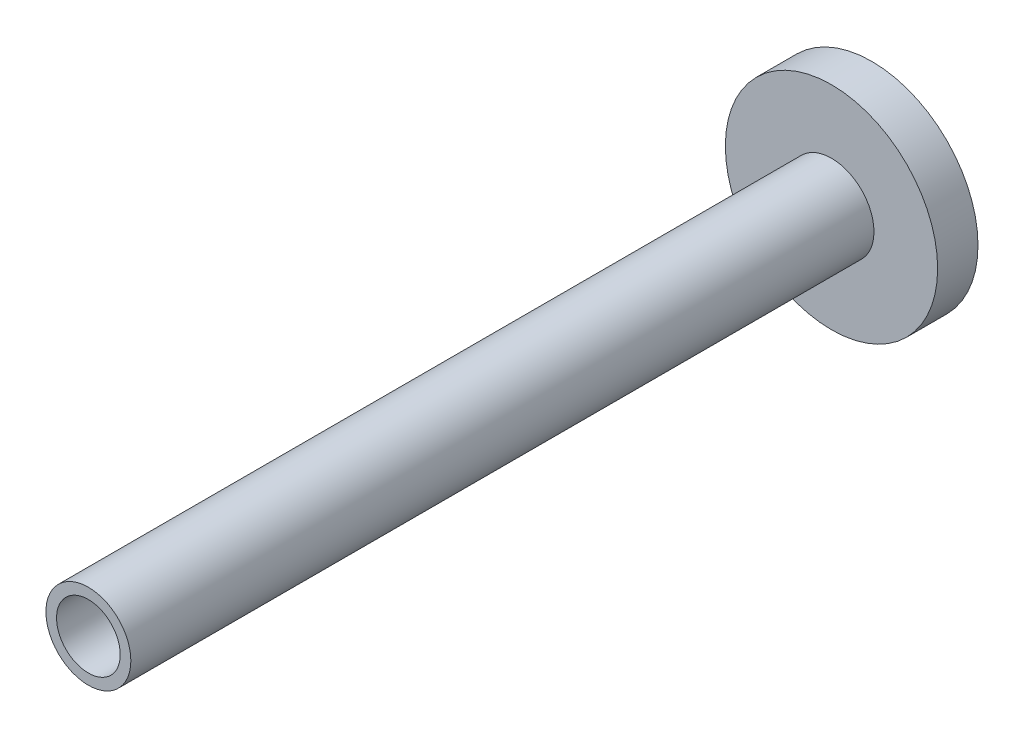
ISO-10303-21;
HEADER;
FILE_DESCRIPTION(('STEP AP214'),'2;1');
FILE_NAME('part.step','',(''),(''),'','','');
FILE_SCHEMA(('AUTOMOTIVE_DESIGN { 1 0 10303 214 1 1 1 1 }'));
ENDSEC;
DATA;
#1=APPLICATION_CONTEXT('core data for automotive mechanical design processes');
#2=APPLICATION_PROTOCOL_DEFINITION('international standard','automotive_design',2000,#1);
#3=PRODUCT_CONTEXT('',#1,'mechanical');
#4=PRODUCT('Part','Part','',(#3));
#5=PRODUCT_RELATED_PRODUCT_CATEGORY('part','',(#4));
#6=PRODUCT_DEFINITION_FORMATION('','',#4);
#7=PRODUCT_DEFINITION_CONTEXT('part definition',#1,'design');
#8=PRODUCT_DEFINITION('design','',#6,#7);
#9=PRODUCT_DEFINITION_SHAPE('','',#8);
#10=(LENGTH_UNIT() NAMED_UNIT(*) SI_UNIT(.MILLI.,.METRE.));
#11=(NAMED_UNIT(*) PLANE_ANGLE_UNIT() SI_UNIT($,.RADIAN.));
#12=(NAMED_UNIT(*) SI_UNIT($,.STERADIAN.) SOLID_ANGLE_UNIT());
#13=UNCERTAINTY_MEASURE_WITH_UNIT(LENGTH_MEASURE(1.E-05),#10,'distance_accuracy_value','');
#14=(GEOMETRIC_REPRESENTATION_CONTEXT(3) GLOBAL_UNCERTAINTY_ASSIGNED_CONTEXT((#13)) GLOBAL_UNIT_ASSIGNED_CONTEXT((#10,
#11,#12)) REPRESENTATION_CONTEXT('',''));
#15=CARTESIAN_POINT('',(0.,0.,0.));
#16=DIRECTION('',(0.,0.,1.));
#17=DIRECTION('',(1.,0.,0.));
#18=AXIS2_PLACEMENT_3D('',#15,#16,#17);
#19=CARTESIAN_POINT('',(0.,0.,1.9));
#20=DIRECTION('',(0.,0.,-1.));
#21=DIRECTION('',(-1.,0.,0.));
#22=AXIS2_PLACEMENT_3D('',#19,#20,#21);
#23=CYLINDRICAL_SURFACE('',#22,5.);
#24=CARTESIAN_POINT('',(0.,0.,1.9));
#25=DIRECTION('',(0.,0.,1.));
#26=DIRECTION('',(1.,0.,0.));
#27=AXIS2_PLACEMENT_3D('',#24,#25,#26);
#28=CIRCLE('',#27,5.);
#29=CARTESIAN_POINT('',(-5.,0.,1.9));
#30=VERTEX_POINT('',#29);
#31=EDGE_CURVE('E10',#30,#30,#28,.T.);
#32=CARTESIAN_POINT('',(0.,0.,0.));
#33=DIRECTION('',(0.,0.,1.));
#34=DIRECTION('',(1.,0.,0.));
#35=AXIS2_PLACEMENT_3D('',#32,#33,#34);
#36=CIRCLE('',#35,5.);
#37=CARTESIAN_POINT('',(-5.,0.,0.));
#38=VERTEX_POINT('',#37);
#39=EDGE_CURVE('E36',#38,#38,#36,.T.);
#40=CARTESIAN_POINT('',(-5.,0.,1.9));
#41=CARTESIAN_POINT('',(-5.,0.,1.88020833333333));
#42=CARTESIAN_POINT('',(-5.,0.,1.86041666666667));
#43=CARTESIAN_POINT('',(-5.,0.,1.82083333333333));
#44=CARTESIAN_POINT('',(-5.,0.,1.80104166666667));
#45=CARTESIAN_POINT('',(-5.,0.,1.76145833333333));
#46=CARTESIAN_POINT('',(-5.,0.,1.74166666666667));
#47=CARTESIAN_POINT('',(-5.,0.,1.70208333333333));
#48=CARTESIAN_POINT('',(-5.,0.,1.68229166666667));
#49=CARTESIAN_POINT('',(-5.,0.,1.64270833333333));
#50=CARTESIAN_POINT('',(-5.,0.,1.62291666666667));
#51=CARTESIAN_POINT('',(-5.,0.,1.58333333333333));
#52=CARTESIAN_POINT('',(-5.,0.,1.56354166666667));
#53=CARTESIAN_POINT('',(-5.,0.,1.52395833333333));
#54=CARTESIAN_POINT('',(-5.,0.,1.50416666666667));
#55=CARTESIAN_POINT('',(-5.,0.,1.46458333333333));
#56=CARTESIAN_POINT('',(-5.,0.,1.44479166666667));
#57=CARTESIAN_POINT('',(-5.,0.,1.40520833333333));
#58=CARTESIAN_POINT('',(-5.,0.,1.38541666666667));
#59=CARTESIAN_POINT('',(-5.,0.,1.34583333333333));
#60=CARTESIAN_POINT('',(-5.,0.,1.32604166666667));
#61=CARTESIAN_POINT('',(-5.,0.,1.28645833333333));
#62=CARTESIAN_POINT('',(-5.,0.,1.26666666666667));
#63=CARTESIAN_POINT('',(-5.,0.,1.22708333333333));
#64=CARTESIAN_POINT('',(-5.,0.,1.20729166666667));
#65=CARTESIAN_POINT('',(-5.,0.,1.16770833333333));
#66=CARTESIAN_POINT('',(-5.,0.,1.14791666666667));
#67=CARTESIAN_POINT('',(-5.,0.,1.10833333333333));
#68=CARTESIAN_POINT('',(-5.,0.,1.08854166666667));
#69=CARTESIAN_POINT('',(-5.,0.,1.04895833333333));
#70=CARTESIAN_POINT('',(-5.,0.,1.02916666666667));
#71=CARTESIAN_POINT('',(-5.,0.,0.989583333333333));
#72=CARTESIAN_POINT('',(-5.,0.,0.969791666666666));
#73=CARTESIAN_POINT('',(-5.,0.,0.930208333333333));
#74=CARTESIAN_POINT('',(-5.,0.,0.910416666666667));
#75=CARTESIAN_POINT('',(-5.,0.,0.870833333333333));
#76=CARTESIAN_POINT('',(-5.,0.,0.851041666666667));
#77=CARTESIAN_POINT('',(-5.,0.,0.811458333333333));
#78=CARTESIAN_POINT('',(-5.,0.,0.791666666666667));
#79=CARTESIAN_POINT('',(-5.,0.,0.752083333333333));
#80=CARTESIAN_POINT('',(-5.,0.,0.732291666666667));
#81=CARTESIAN_POINT('',(-5.,0.,0.692708333333333));
#82=CARTESIAN_POINT('',(-5.,0.,0.672916666666667));
#83=CARTESIAN_POINT('',(-5.,0.,0.633333333333333));
#84=CARTESIAN_POINT('',(-5.,0.,0.613541666666667));
#85=CARTESIAN_POINT('',(-5.,0.,0.573958333333333));
#86=CARTESIAN_POINT('',(-5.,0.,0.554166666666667));
#87=CARTESIAN_POINT('',(-5.,0.,0.514583333333334));
#88=CARTESIAN_POINT('',(-5.,0.,0.494791666666667));
#89=CARTESIAN_POINT('',(-5.,0.,0.455208333333333));
#90=CARTESIAN_POINT('',(-5.,0.,0.435416666666667));
#91=CARTESIAN_POINT('',(-5.,0.,0.395833333333333));
#92=CARTESIAN_POINT('',(-5.,0.,0.376041666666667));
#93=CARTESIAN_POINT('',(-5.,0.,0.336458333333333));
#94=CARTESIAN_POINT('',(-5.,0.,0.316666666666667));
#95=CARTESIAN_POINT('',(-5.,0.,0.277083333333333));
#96=CARTESIAN_POINT('',(-5.,0.,0.257291666666667));
#97=CARTESIAN_POINT('',(-5.,0.,0.217708333333333));
#98=CARTESIAN_POINT('',(-5.,0.,0.197916666666667));
#99=CARTESIAN_POINT('',(-5.,0.,0.158333333333333));
#100=CARTESIAN_POINT('',(-5.,0.,0.138541666666667));
#101=CARTESIAN_POINT('',(-5.,0.,0.0989583333333333));
#102=CARTESIAN_POINT('',(-5.,0.,0.0791666666666666));
#103=CARTESIAN_POINT('',(-5.,0.,0.0395833333333333));
#104=CARTESIAN_POINT('',(-5.,0.,0.0197916666666666));
#105=CARTESIAN_POINT('',(-5.,0.,0.));
#106=B_SPLINE_CURVE_WITH_KNOTS('',3,(#40,#41,#42,#43,#44,#45,#46,#47,#48,#49,#50,#51,#52,#53,
#54,#55,#56,#57,#58,#59,#60,#61,#62,#63,#64,#65,#66,#67,#68,#69,#70,#71,#72,#73,#74,#75,#76,#77,
#78,#79,#80,#81,#82,#83,#84,#85,#86,#87,#88,#89,#90,#91,#92,#93,#94,#95,#96,#97,#98,#99,#100,
#101,#102,#103,#104,#105),.UNSPECIFIED.,.F.,.F.,(4,2,2,2,2,2,2,2,2,2,2,2,2,2,2,2,2,2,2,2,2,2,2,
2,2,2,2,2,2,2,2,2,4),(0.,0.0593750000000002,0.11875,0.178125,0.2375,0.296875,0.35625,0.415625,
0.475,0.534375,0.59375,0.653125,0.7125,0.771875,0.83125,0.890625,0.95,1.009375,1.06875,1.128125,
1.1875,1.246875,1.30625,1.365625,1.425,1.484375,1.54375,1.603125,1.6625,1.721875,1.78125,
1.840625,1.9),.UNSPECIFIED.);
#107=EDGE_CURVE('BSEAM33',#30,#38,#106,.T.);
#108=ORIENTED_EDGE('',*,*,#31,.F.);
#109=ORIENTED_EDGE('',*,*,#39,.T.);
#110=ORIENTED_EDGE('',*,*,#107,.T.);
#111=ORIENTED_EDGE('',*,*,#107,.F.);
#112=EDGE_LOOP('',(#108,#110,#109,#111));
#113=FACE_BOUND('',#112,.T.);
#114=ADVANCED_FACE('F33',(#113),#23,.T.);
#115=CARTESIAN_POINT('',(0.,0.,1.9));
#116=DIRECTION('',(0.,0.,1.));
#117=DIRECTION('',(1.,0.,0.));
#118=AXIS2_PLACEMENT_3D('',#115,#116,#117);
#119=PLANE('',#118);
#120=CARTESIAN_POINT('',(0.,0.,1.9));
#121=DIRECTION('',(0.,0.,1.));
#122=DIRECTION('',(1.,0.,0.));
#123=AXIS2_PLACEMENT_3D('',#120,#121,#122);
#124=CIRCLE('',#123,2.);
#125=CARTESIAN_POINT('',(2.,0.,1.9));
#126=VERTEX_POINT('',#125);
#127=EDGE_CURVE('E45',#126,#126,#124,.T.);
#128=ORIENTED_EDGE('',*,*,#127,.F.);
#129=EDGE_LOOP('',(#128));
#130=FACE_BOUND('',#129,.T.);
#131=ORIENTED_EDGE('',*,*,#31,.T.);
#132=EDGE_LOOP('',(#131));
#133=FACE_BOUND('',#132,.T.);
#134=ADVANCED_FACE('F78',(#130,#133),#119,.T.);
#135=CARTESIAN_POINT('',(0.,0.,0.));
#136=DIRECTION('',(0.,0.,1.));
#137=DIRECTION('',(1.,0.,0.));
#138=AXIS2_PLACEMENT_3D('',#135,#136,#137);
#139=PLANE('',#138);
#140=ORIENTED_EDGE('',*,*,#39,.F.);
#141=EDGE_LOOP('',(#140));
#142=FACE_BOUND('',#141,.T.);
#143=ADVANCED_FACE('F74',(#142),#139,.F.);
#144=CARTESIAN_POINT('',(0.,0.,36.9));
#145=DIRECTION('',(0.,0.,-1.));
#146=DIRECTION('',(-1.,0.,0.));
#147=AXIS2_PLACEMENT_3D('',#144,#145,#146);
#148=CYLINDRICAL_SURFACE('',#147,2.);
#149=CARTESIAN_POINT('',(0.,0.,36.9));
#150=DIRECTION('',(0.,0.,1.));
#151=DIRECTION('',(1.,0.,0.));
#152=AXIS2_PLACEMENT_3D('',#149,#150,#151);
#153=CIRCLE('',#152,2.);
#154=CARTESIAN_POINT('',(2.,0.,36.9));
#155=VERTEX_POINT('',#154);
#156=EDGE_CURVE('E43',#155,#155,#153,.T.);
#157=ORIENTED_EDGE('',*,*,#156,.F.);
#158=EDGE_LOOP('',(#157));
#159=FACE_BOUND('',#158,.T.);
#160=ORIENTED_EDGE('',*,*,#127,.T.);
#161=EDGE_LOOP('',(#160));
#162=FACE_BOUND('',#161,.T.);
#163=ADVANCED_FACE('F68',(#159,#162),#148,.T.);
#164=CARTESIAN_POINT('',(0.,0.,36.9));
#165=DIRECTION('',(0.,0.,1.));
#166=DIRECTION('',(1.,0.,0.));
#167=AXIS2_PLACEMENT_3D('',#164,#165,#166);
#168=PLANE('',#167);
#169=CARTESIAN_POINT('',(0.,0.,36.9));
#170=DIRECTION('',(0.,0.,1.));
#171=DIRECTION('',(1.,0.,0.));
#172=AXIS2_PLACEMENT_3D('',#169,#170,#171);
#173=CIRCLE('',#172,1.5);
#174=CARTESIAN_POINT('',(1.5,0.,36.9));
#175=VERTEX_POINT('',#174);
#176=EDGE_CURVE('E51',#175,#175,#173,.T.);
#177=ORIENTED_EDGE('',*,*,#176,.F.);
#178=EDGE_LOOP('',(#177));
#179=FACE_BOUND('',#178,.T.);
#180=ORIENTED_EDGE('',*,*,#156,.T.);
#181=EDGE_LOOP('',(#180));
#182=FACE_BOUND('',#181,.T.);
#183=ADVANCED_FACE('F62',(#179,#182),#168,.T.);
#184=CARTESIAN_POINT('',(0.,0.,24.9));
#185=DIRECTION('',(0.,0.,1.));
#186=DIRECTION('',(1.,0.,0.));
#187=AXIS2_PLACEMENT_3D('',#184,#185,#186);
#188=CYLINDRICAL_SURFACE('',#187,1.5);
#189=CARTESIAN_POINT('',(0.,0.,24.9));
#190=DIRECTION('',(0.,0.,1.));
#191=DIRECTION('',(1.,0.,0.));
#192=AXIS2_PLACEMENT_3D('',#189,#190,#191);
#193=CIRCLE('',#192,1.5);
#194=CARTESIAN_POINT('',(1.5,0.,24.9));
#195=VERTEX_POINT('',#194);
#196=EDGE_CURVE('E48',#195,#195,#193,.T.);
#197=ORIENTED_EDGE('',*,*,#196,.F.);
#198=EDGE_LOOP('',(#197));
#199=FACE_BOUND('',#198,.T.);
#200=ORIENTED_EDGE('',*,*,#176,.T.);
#201=EDGE_LOOP('',(#200));
#202=FACE_BOUND('',#201,.T.);
#203=ADVANCED_FACE('F59',(#199,#202),#188,.F.);
#204=CARTESIAN_POINT('',(0.,0.,24.9));
#205=DIRECTION('',(0.,0.,1.));
#206=DIRECTION('',(1.,0.,0.));
#207=AXIS2_PLACEMENT_3D('',#204,#205,#206);
#208=PLANE('',#207);
#209=ORIENTED_EDGE('',*,*,#196,.T.);
#210=EDGE_LOOP('',(#209));
#211=FACE_BOUND('',#210,.T.);
#212=ADVANCED_FACE('F57',(#211),#208,.T.);
#213=CLOSED_SHELL('',(#114,#134,#143,#163,#183,#203,#212));
#214=MANIFOLD_SOLID_BREP('B2',#213);
#215=ADVANCED_BREP_SHAPE_REPRESENTATION('',(#18,#214),#14);
#216=SHAPE_DEFINITION_REPRESENTATION(#9,#215);
ENDSEC;
END-ISO-10303-21;
